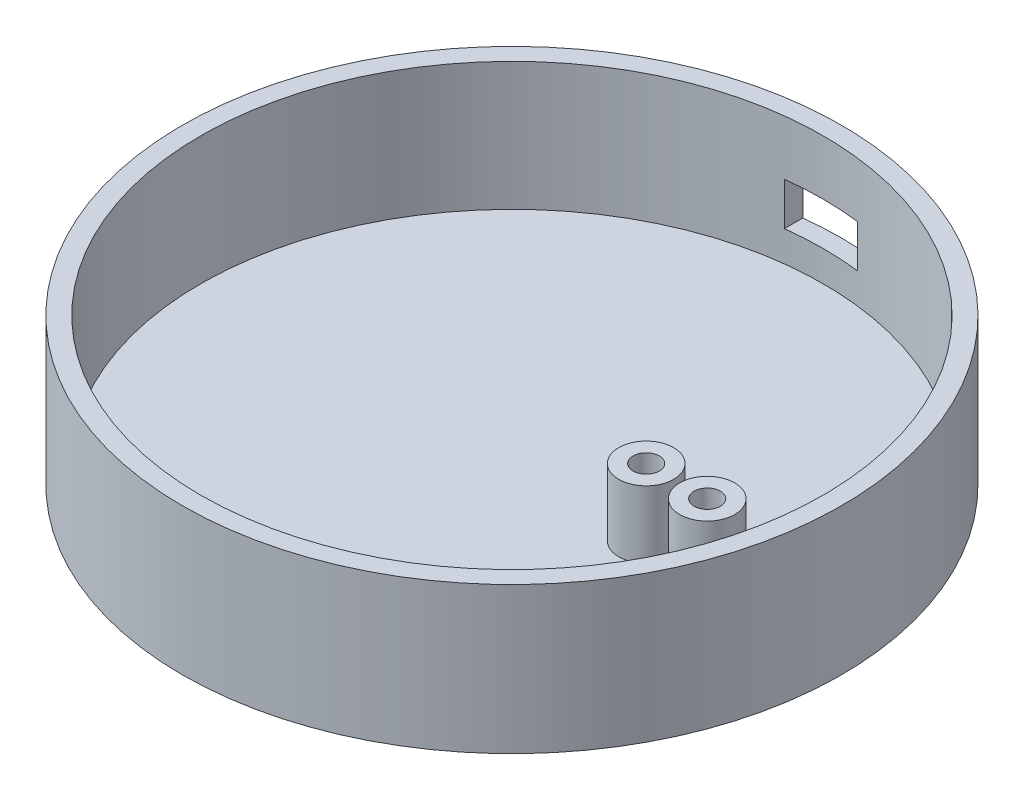
ISO-10303-21;
HEADER;
FILE_DESCRIPTION(('STEP AP214'),'2;1');
FILE_NAME('part.step','',(''),(''),'','','');
FILE_SCHEMA(('AUTOMOTIVE_DESIGN { 1 0 10303 214 1 1 1 1 }'));
ENDSEC;
DATA;
#1=APPLICATION_CONTEXT('core data for automotive mechanical design processes');
#2=APPLICATION_PROTOCOL_DEFINITION('international standard','automotive_design',2000,#1);
#3=PRODUCT_CONTEXT('',#1,'mechanical');
#4=PRODUCT('Part','Part','',(#3));
#5=PRODUCT_RELATED_PRODUCT_CATEGORY('part','',(#4));
#6=PRODUCT_DEFINITION_FORMATION('','',#4);
#7=PRODUCT_DEFINITION_CONTEXT('part definition',#1,'design');
#8=PRODUCT_DEFINITION('design','',#6,#7);
#9=PRODUCT_DEFINITION_SHAPE('','',#8);
#10=(LENGTH_UNIT() NAMED_UNIT(*) SI_UNIT(.MILLI.,.METRE.));
#11=(NAMED_UNIT(*) PLANE_ANGLE_UNIT() SI_UNIT($,.RADIAN.));
#12=(NAMED_UNIT(*) SI_UNIT($,.STERADIAN.) SOLID_ANGLE_UNIT());
#13=UNCERTAINTY_MEASURE_WITH_UNIT(LENGTH_MEASURE(1.E-05),#10,'distance_accuracy_value','');
#14=(GEOMETRIC_REPRESENTATION_CONTEXT(3) GLOBAL_UNCERTAINTY_ASSIGNED_CONTEXT((#13)) GLOBAL_UNIT_ASSIGNED_CONTEXT((#10,
#11,#12)) REPRESENTATION_CONTEXT('',''));
#15=CARTESIAN_POINT('',(0.,0.,0.));
#16=DIRECTION('',(0.,0.,1.));
#17=DIRECTION('',(1.,0.,0.));
#18=AXIS2_PLACEMENT_3D('',#15,#16,#17);
#19=CARTESIAN_POINT('',(0.,3.,0.));
#20=DIRECTION('',(0.,-1.,0.));
#21=DIRECTION('',(0.,0.,-1.));
#22=AXIS2_PLACEMENT_3D('',#19,#20,#21);
#23=CYLINDRICAL_SURFACE('',#22,54.);
#24=CARTESIAN_POINT('',(0.,24.,0.));
#25=DIRECTION('',(0.,1.,0.));
#26=DIRECTION('',(0.,0.,1.));
#27=AXIS2_PLACEMENT_3D('',#24,#25,#26);
#28=CIRCLE('',#27,54.);
#29=CARTESIAN_POINT('',(0.,24.,54.));
#30=VERTEX_POINT('',#29);
#31=EDGE_CURVE('E123',#30,#30,#28,.T.);
#32=ORIENTED_EDGE('',*,*,#31,.F.);
#33=EDGE_LOOP('',(#32));
#34=FACE_BOUND('',#33,.T.);
#35=CARTESIAN_POINT('',(0.,0.,0.));
#36=DIRECTION('',(0.,1.,0.));
#37=DIRECTION('',(0.,0.,1.));
#38=AXIS2_PLACEMENT_3D('',#35,#36,#37);
#39=CIRCLE('',#38,54.);
#40=CARTESIAN_POINT('',(0.,0.,54.));
#41=VERTEX_POINT('',#40);
#42=EDGE_CURVE('E126',#41,#41,#39,.T.);
#43=ORIENTED_EDGE('',*,*,#42,.T.);
#44=EDGE_LOOP('',(#43));
#45=FACE_BOUND('',#44,.T.);
#46=CARTESIAN_POINT('',(0.,15.,0.));
#47=DIRECTION('',(0.,-1.,0.));
#48=DIRECTION('',(0.,0.,-1.));
#49=AXIS2_PLACEMENT_3D('',#46,#47,#48);
#50=CIRCLE('',#49,54.);
#51=CARTESIAN_POINT('',(-6.,15.,-53.6656314599949));
#52=VERTEX_POINT('',#51);
#53=CARTESIAN_POINT('',(6.,15.,-53.6656314599949));
#54=VERTEX_POINT('',#53);
#55=EDGE_CURVE('E83',#52,#54,#50,.T.);
#56=ORIENTED_EDGE('',*,*,#55,.F.);
#57=DIRECTION('',(0.,-1.,0.));
#58=VECTOR('',#57,1.);
#59=CARTESIAN_POINT('',(-6.,3.,-53.6656314599949));
#60=LINE('',#59,#58);
#61=CARTESIAN_POINT('',(-6.,8.,-53.6656314599949));
#62=VERTEX_POINT('',#61);
#63=EDGE_CURVE('E89',#62,#52,#60,.F.);
#64=ORIENTED_EDGE('',*,*,#63,.F.);
#65=CARTESIAN_POINT('',(0.,8.,0.));
#66=DIRECTION('',(0.,-1.,0.));
#67=DIRECTION('',(0.,0.,-1.));
#68=AXIS2_PLACEMENT_3D('',#65,#66,#67);
#69=CIRCLE('',#68,54.);
#70=CARTESIAN_POINT('',(6.,8.,-53.6656314599949));
#71=VERTEX_POINT('',#70);
#72=EDGE_CURVE('E78',#62,#71,#69,.T.);
#73=ORIENTED_EDGE('',*,*,#72,.T.);
#74=DIRECTION('',(0.,-1.,0.));
#75=VECTOR('',#74,1.);
#76=CARTESIAN_POINT('',(6.,3.,-53.6656314599949));
#77=LINE('',#76,#75);
#78=EDGE_CURVE('E96',#54,#71,#77,.T.);
#79=ORIENTED_EDGE('',*,*,#78,.F.);
#80=EDGE_LOOP('',(#56,#64,#73,#79));
#81=FACE_BOUND('',#80,.T.);
#82=ADVANCED_FACE('F41',(#34,#45,#81),#23,.T.);
#83=CARTESIAN_POINT('',(0.,24.,0.));
#84=DIRECTION('',(0.,-1.,0.));
#85=DIRECTION('',(0.,0.,-1.));
#86=AXIS2_PLACEMENT_3D('',#83,#84,#85);
#87=CYLINDRICAL_SURFACE('',#86,51.);
#88=CARTESIAN_POINT('',(0.,3.,0.));
#89=DIRECTION('',(0.,1.,0.));
#90=DIRECTION('',(0.,0.,1.));
#91=AXIS2_PLACEMENT_3D('',#88,#89,#90);
#92=CIRCLE('',#91,51.);
#93=CARTESIAN_POINT('',(0.,3.,51.));
#94=VERTEX_POINT('',#93);
#95=EDGE_CURVE('E127',#94,#94,#92,.F.);
#96=ORIENTED_EDGE('',*,*,#95,.T.);
#97=EDGE_LOOP('',(#96));
#98=FACE_BOUND('',#97,.T.);
#99=CARTESIAN_POINT('',(0.,24.,0.));
#100=DIRECTION('',(0.,1.,0.));
#101=DIRECTION('',(0.,0.,1.));
#102=AXIS2_PLACEMENT_3D('',#99,#100,#101);
#103=CIRCLE('',#102,51.);
#104=CARTESIAN_POINT('',(0.,24.,51.));
#105=VERTEX_POINT('',#104);
#106=EDGE_CURVE('E120',#105,#105,#103,.T.);
#107=ORIENTED_EDGE('',*,*,#106,.T.);
#108=EDGE_LOOP('',(#107));
#109=FACE_BOUND('',#108,.T.);
#110=DIRECTION('',(0.,-1.,0.));
#111=VECTOR('',#110,1.);
#112=CARTESIAN_POINT('',(-6.,24.,-50.6458290484024));
#113=LINE('',#112,#111);
#114=CARTESIAN_POINT('',(-6.,8.,-50.6458290484024));
#115=VERTEX_POINT('',#114);
#116=CARTESIAN_POINT('',(-6.,15.,-50.6458290484024));
#117=VERTEX_POINT('',#116);
#118=EDGE_CURVE('E48',#115,#117,#113,.F.);
#119=ORIENTED_EDGE('',*,*,#118,.T.);
#120=CARTESIAN_POINT('',(0.,15.,0.));
#121=DIRECTION('',(0.,-1.,0.));
#122=DIRECTION('',(0.,0.,-1.));
#123=AXIS2_PLACEMENT_3D('',#120,#121,#122);
#124=CIRCLE('',#123,51.);
#125=CARTESIAN_POINT('',(6.,15.,-50.6458290484024));
#126=VERTEX_POINT('',#125);
#127=EDGE_CURVE('E11',#117,#126,#124,.T.);
#128=ORIENTED_EDGE('',*,*,#127,.T.);
#129=DIRECTION('',(0.,-1.,0.));
#130=VECTOR('',#129,1.);
#131=CARTESIAN_POINT('',(6.,24.,-50.6458290484024));
#132=LINE('',#131,#130);
#133=CARTESIAN_POINT('',(6.,8.,-50.6458290484024));
#134=VERTEX_POINT('',#133);
#135=EDGE_CURVE('E138',#126,#134,#132,.T.);
#136=ORIENTED_EDGE('',*,*,#135,.T.);
#137=CARTESIAN_POINT('',(0.,8.,0.));
#138=DIRECTION('',(0.,-1.,0.));
#139=DIRECTION('',(0.,0.,-1.));
#140=AXIS2_PLACEMENT_3D('',#137,#138,#139);
#141=CIRCLE('',#140,51.);
#142=EDGE_CURVE('E130',#115,#134,#141,.T.);
#143=ORIENTED_EDGE('',*,*,#142,.F.);
#144=EDGE_LOOP('',(#119,#128,#136,#143));
#145=FACE_BOUND('',#144,.T.);
#146=ADVANCED_FACE('F141',(#98,#109,#145),#87,.F.);
#147=CARTESIAN_POINT('',(0.,0.,0.));
#148=DIRECTION('',(0.,1.,0.));
#149=DIRECTION('',(0.,0.,1.));
#150=AXIS2_PLACEMENT_3D('',#147,#148,#149);
#151=PLANE('',#150);
#152=CARTESIAN_POINT('',(22.,0.,0.));
#153=DIRECTION('',(0.,1.,0.));
#154=DIRECTION('',(0.,0.,1.));
#155=AXIS2_PLACEMENT_3D('',#152,#153,#154);
#156=CIRCLE('',#155,2.15);
#157=CARTESIAN_POINT('',(22.,0.,2.15));
#158=VERTEX_POINT('',#157);
#159=EDGE_CURVE('E108',#158,#158,#156,.T.);
#160=ORIENTED_EDGE('',*,*,#159,.T.);
#161=EDGE_LOOP('',(#160));
#162=FACE_BOUND('',#161,.T.);
#163=CARTESIAN_POINT('',(32.,0.,0.));
#164=DIRECTION('',(0.,1.,0.));
#165=DIRECTION('',(0.,0.,1.));
#166=AXIS2_PLACEMENT_3D('',#163,#164,#165);
#167=CIRCLE('',#166,2.15);
#168=CARTESIAN_POINT('',(32.,0.,2.15));
#169=VERTEX_POINT('',#168);
#170=EDGE_CURVE('E99',#169,#169,#167,.T.);
#171=ORIENTED_EDGE('',*,*,#170,.T.);
#172=EDGE_LOOP('',(#171));
#173=FACE_BOUND('',#172,.T.);
#174=ORIENTED_EDGE('',*,*,#42,.F.);
#175=EDGE_LOOP('',(#174));
#176=FACE_BOUND('',#175,.T.);
#177=ADVANCED_FACE('F165',(#162,#173,#176),#151,.F.);
#178=CARTESIAN_POINT('',(0.,24.,0.));
#179=DIRECTION('',(0.,1.,0.));
#180=DIRECTION('',(0.,0.,1.));
#181=AXIS2_PLACEMENT_3D('',#178,#179,#180);
#182=PLANE('',#181);
#183=ORIENTED_EDGE('',*,*,#31,.T.);
#184=EDGE_LOOP('',(#183));
#185=FACE_BOUND('',#184,.T.);
#186=ORIENTED_EDGE('',*,*,#106,.F.);
#187=EDGE_LOOP('',(#186));
#188=FACE_BOUND('',#187,.T.);
#189=ADVANCED_FACE('F173',(#185,#188),#182,.T.);
#190=CARTESIAN_POINT('',(0.,3.,0.));
#191=DIRECTION('',(0.,1.,0.));
#192=DIRECTION('',(0.,0.,1.));
#193=AXIS2_PLACEMENT_3D('',#190,#191,#192);
#194=PLANE('',#193);
#195=CARTESIAN_POINT('',(32.,3.,0.));
#196=DIRECTION('',(0.,1.,0.));
#197=DIRECTION('',(0.,0.,1.));
#198=AXIS2_PLACEMENT_3D('',#195,#196,#197);
#199=CIRCLE('',#198,4.5);
#200=CARTESIAN_POINT('',(32.,3.,4.5));
#201=VERTEX_POINT('',#200);
#202=EDGE_CURVE('E115',#201,#201,#199,.F.);
#203=ORIENTED_EDGE('',*,*,#202,.T.);
#204=EDGE_LOOP('',(#203));
#205=FACE_BOUND('',#204,.T.);
#206=CARTESIAN_POINT('',(22.,3.,0.));
#207=DIRECTION('',(0.,1.,0.));
#208=DIRECTION('',(0.,0.,1.));
#209=AXIS2_PLACEMENT_3D('',#206,#207,#208);
#210=CIRCLE('',#209,4.5);
#211=CARTESIAN_POINT('',(22.,3.,4.5));
#212=VERTEX_POINT('',#211);
#213=EDGE_CURVE('E119',#212,#212,#210,.F.);
#214=ORIENTED_EDGE('',*,*,#213,.T.);
#215=EDGE_LOOP('',(#214));
#216=FACE_BOUND('',#215,.T.);
#217=ORIENTED_EDGE('',*,*,#95,.F.);
#218=EDGE_LOOP('',(#217));
#219=FACE_BOUND('',#218,.T.);
#220=ADVANCED_FACE('F178',(#205,#216,#219),#194,.T.);
#221=CARTESIAN_POINT('',(22.,14.,0.));
#222=DIRECTION('',(0.,-1.,0.));
#223=DIRECTION('',(0.,0.,-1.));
#224=AXIS2_PLACEMENT_3D('',#221,#222,#223);
#225=CYLINDRICAL_SURFACE('',#224,4.5);
#226=ORIENTED_EDGE('',*,*,#213,.F.);
#227=EDGE_LOOP('',(#226));
#228=FACE_BOUND('',#227,.T.);
#229=CARTESIAN_POINT('',(22.,14.,0.));
#230=DIRECTION('',(0.,1.,0.));
#231=DIRECTION('',(0.,0.,1.));
#232=AXIS2_PLACEMENT_3D('',#229,#230,#231);
#233=CIRCLE('',#232,4.5);
#234=CARTESIAN_POINT('',(22.,14.,4.5));
#235=VERTEX_POINT('',#234);
#236=EDGE_CURVE('E116',#235,#235,#233,.T.);
#237=ORIENTED_EDGE('',*,*,#236,.F.);
#238=EDGE_LOOP('',(#237));
#239=FACE_BOUND('',#238,.T.);
#240=ADVANCED_FACE('F184',(#228,#239),#225,.T.);
#241=CARTESIAN_POINT('',(22.,14.,0.));
#242=DIRECTION('',(0.,1.,0.));
#243=DIRECTION('',(0.,0.,1.));
#244=AXIS2_PLACEMENT_3D('',#241,#242,#243);
#245=PLANE('',#244);
#246=CARTESIAN_POINT('',(22.,14.,0.));
#247=DIRECTION('',(0.,1.,0.));
#248=DIRECTION('',(0.,0.,1.));
#249=AXIS2_PLACEMENT_3D('',#246,#247,#248);
#250=CIRCLE('',#249,2.15);
#251=CARTESIAN_POINT('',(22.,14.,2.15));
#252=VERTEX_POINT('',#251);
#253=EDGE_CURVE('E104',#252,#252,#250,.T.);
#254=ORIENTED_EDGE('',*,*,#253,.F.);
#255=EDGE_LOOP('',(#254));
#256=FACE_BOUND('',#255,.T.);
#257=ORIENTED_EDGE('',*,*,#236,.T.);
#258=EDGE_LOOP('',(#257));
#259=FACE_BOUND('',#258,.T.);
#260=ADVANCED_FACE('F189',(#256,#259),#245,.T.);
#261=CARTESIAN_POINT('',(32.,14.,0.));
#262=DIRECTION('',(0.,-1.,0.));
#263=DIRECTION('',(0.,0.,-1.));
#264=AXIS2_PLACEMENT_3D('',#261,#262,#263);
#265=CYLINDRICAL_SURFACE('',#264,4.5);
#266=ORIENTED_EDGE('',*,*,#202,.F.);
#267=EDGE_LOOP('',(#266));
#268=FACE_BOUND('',#267,.T.);
#269=CARTESIAN_POINT('',(32.,14.,0.));
#270=DIRECTION('',(0.,1.,0.));
#271=DIRECTION('',(0.,0.,1.));
#272=AXIS2_PLACEMENT_3D('',#269,#270,#271);
#273=CIRCLE('',#272,4.5);
#274=CARTESIAN_POINT('',(32.,14.,4.5));
#275=VERTEX_POINT('',#274);
#276=EDGE_CURVE('E107',#275,#275,#273,.T.);
#277=ORIENTED_EDGE('',*,*,#276,.F.);
#278=EDGE_LOOP('',(#277));
#279=FACE_BOUND('',#278,.T.);
#280=ADVANCED_FACE('F193',(#268,#279),#265,.T.);
#281=CARTESIAN_POINT('',(32.,14.,0.));
#282=DIRECTION('',(0.,1.,0.));
#283=DIRECTION('',(0.,0.,1.));
#284=AXIS2_PLACEMENT_3D('',#281,#282,#283);
#285=PLANE('',#284);
#286=CARTESIAN_POINT('',(32.,14.,0.));
#287=DIRECTION('',(0.,1.,0.));
#288=DIRECTION('',(0.,0.,1.));
#289=AXIS2_PLACEMENT_3D('',#286,#287,#288);
#290=CIRCLE('',#289,2.15);
#291=CARTESIAN_POINT('',(32.,14.,2.15));
#292=VERTEX_POINT('',#291);
#293=EDGE_CURVE('E95',#292,#292,#290,.T.);
#294=ORIENTED_EDGE('',*,*,#293,.F.);
#295=EDGE_LOOP('',(#294));
#296=FACE_BOUND('',#295,.T.);
#297=ORIENTED_EDGE('',*,*,#276,.T.);
#298=EDGE_LOOP('',(#297));
#299=FACE_BOUND('',#298,.T.);
#300=ADVANCED_FACE('F195',(#296,#299),#285,.T.);
#301=CARTESIAN_POINT('',(32.,14.,0.));
#302=DIRECTION('',(0.,-1.,0.));
#303=DIRECTION('',(0.,0.,-1.));
#304=AXIS2_PLACEMENT_3D('',#301,#302,#303);
#305=CYLINDRICAL_SURFACE('',#304,2.15);
#306=ORIENTED_EDGE('',*,*,#293,.T.);
#307=EDGE_LOOP('',(#306));
#308=FACE_BOUND('',#307,.T.);
#309=ORIENTED_EDGE('',*,*,#170,.F.);
#310=EDGE_LOOP('',(#309));
#311=FACE_BOUND('',#310,.T.);
#312=ADVANCED_FACE('F198',(#308,#311),#305,.F.);
#313=CARTESIAN_POINT('',(22.,14.,0.));
#314=DIRECTION('',(0.,-1.,0.));
#315=DIRECTION('',(0.,0.,-1.));
#316=AXIS2_PLACEMENT_3D('',#313,#314,#315);
#317=CYLINDRICAL_SURFACE('',#316,2.15);
#318=ORIENTED_EDGE('',*,*,#253,.T.);
#319=EDGE_LOOP('',(#318));
#320=FACE_BOUND('',#319,.T.);
#321=ORIENTED_EDGE('',*,*,#159,.F.);
#322=EDGE_LOOP('',(#321));
#323=FACE_BOUND('',#322,.T.);
#324=ADVANCED_FACE('F205',(#320,#323),#317,.F.);
#325=CARTESIAN_POINT('',(-6.,15.,-49.));
#326=DIRECTION('',(1.,0.,0.));
#327=DIRECTION('',(0.,0.,-1.));
#328=AXIS2_PLACEMENT_3D('',#325,#326,#327);
#329=PLANE('',#328);
#330=ORIENTED_EDGE('',*,*,#63,.T.);
#331=DIRECTION('',(0.,0.,1.));
#332=VECTOR('',#331,1.);
#333=CARTESIAN_POINT('',(-6.,15.,-49.));
#334=LINE('',#333,#332);
#335=EDGE_CURVE('E146',#52,#117,#334,.T.);
#336=ORIENTED_EDGE('',*,*,#335,.T.);
#337=ORIENTED_EDGE('',*,*,#118,.F.);
#338=DIRECTION('',(0.,0.,1.));
#339=VECTOR('',#338,1.);
#340=CARTESIAN_POINT('',(-6.,8.,-49.));
#341=LINE('',#340,#339);
#342=EDGE_CURVE('E60',#62,#115,#341,.T.);
#343=ORIENTED_EDGE('',*,*,#342,.F.);
#344=EDGE_LOOP('',(#330,#336,#337,#343));
#345=FACE_BOUND('',#344,.T.);
#346=ADVANCED_FACE('F87',(#345),#329,.T.);
#347=CARTESIAN_POINT('',(6.,15.,-49.));
#348=DIRECTION('',(-1.,0.,0.));
#349=DIRECTION('',(0.,0.,1.));
#350=AXIS2_PLACEMENT_3D('',#347,#348,#349);
#351=PLANE('',#350);
#352=ORIENTED_EDGE('',*,*,#78,.T.);
#353=DIRECTION('',(0.,0.,-1.));
#354=VECTOR('',#353,1.);
#355=CARTESIAN_POINT('',(6.,8.,-49.));
#356=LINE('',#355,#354);
#357=EDGE_CURVE('E55',#134,#71,#356,.T.);
#358=ORIENTED_EDGE('',*,*,#357,.F.);
#359=ORIENTED_EDGE('',*,*,#135,.F.);
#360=DIRECTION('',(0.,0.,-1.));
#361=VECTOR('',#360,1.);
#362=CARTESIAN_POINT('',(6.,15.,-49.));
#363=LINE('',#362,#361);
#364=EDGE_CURVE('E84',#126,#54,#363,.T.);
#365=ORIENTED_EDGE('',*,*,#364,.T.);
#366=EDGE_LOOP('',(#352,#358,#359,#365));
#367=FACE_BOUND('',#366,.T.);
#368=ADVANCED_FACE('F143',(#367),#351,.T.);
#369=CARTESIAN_POINT('',(0.,15.,0.));
#370=DIRECTION('',(0.,-1.,0.));
#371=DIRECTION('',(0.,0.,-1.));
#372=AXIS2_PLACEMENT_3D('',#369,#370,#371);
#373=PLANE('',#372);
#374=ORIENTED_EDGE('',*,*,#55,.T.);
#375=ORIENTED_EDGE('',*,*,#364,.F.);
#376=ORIENTED_EDGE('',*,*,#127,.F.);
#377=ORIENTED_EDGE('',*,*,#335,.F.);
#378=EDGE_LOOP('',(#374,#375,#376,#377));
#379=FACE_BOUND('',#378,.T.);
#380=ADVANCED_FACE('F151',(#379),#373,.T.);
#381=CARTESIAN_POINT('',(0.,8.,0.));
#382=DIRECTION('',(0.,-1.,0.));
#383=DIRECTION('',(0.,0.,-1.));
#384=AXIS2_PLACEMENT_3D('',#381,#382,#383);
#385=PLANE('',#384);
#386=ORIENTED_EDGE('',*,*,#342,.T.);
#387=ORIENTED_EDGE('',*,*,#142,.T.);
#388=ORIENTED_EDGE('',*,*,#357,.T.);
#389=ORIENTED_EDGE('',*,*,#72,.F.);
#390=EDGE_LOOP('',(#386,#387,#388,#389));
#391=FACE_BOUND('',#390,.T.);
#392=ADVANCED_FACE('F79',(#391),#385,.F.);
#393=CLOSED_SHELL('',(#82,#146,#177,#189,#220,#240,#260,#280,#300,#312,#324,#346,#368,#380,#392));
#394=MANIFOLD_SOLID_BREP('B2',#393);
#395=ADVANCED_BREP_SHAPE_REPRESENTATION('',(#18,#394),#14);
#396=SHAPE_DEFINITION_REPRESENTATION(#9,#395);
ENDSEC;
END-ISO-10303-21;
